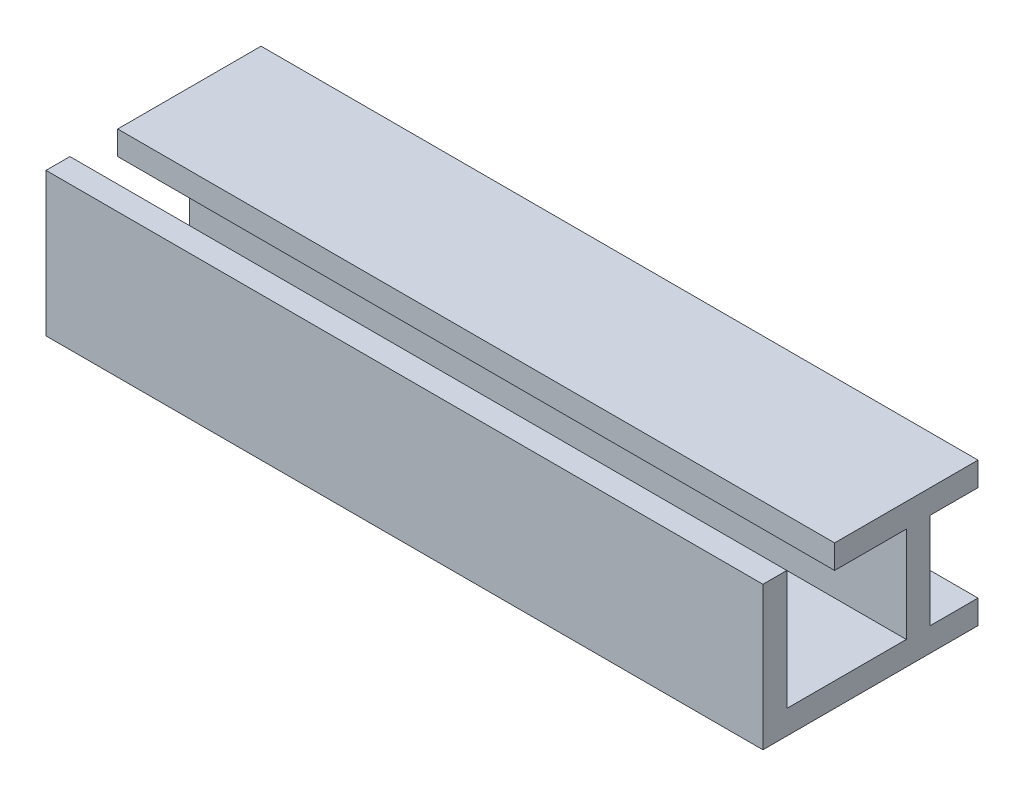
ISO-10303-21;
HEADER;
FILE_DESCRIPTION(('STEP AP214'),'2;1');
FILE_NAME('part.step','',(''),(''),'','','');
FILE_SCHEMA(('AUTOMOTIVE_DESIGN { 1 0 10303 214 1 1 1 1 }'));
ENDSEC;
DATA;
#1=APPLICATION_CONTEXT('core data for automotive mechanical design processes');
#2=APPLICATION_PROTOCOL_DEFINITION('international standard','automotive_design',2000,#1);
#3=PRODUCT_CONTEXT('',#1,'mechanical');
#4=PRODUCT('Part','Part','',(#3));
#5=PRODUCT_RELATED_PRODUCT_CATEGORY('part','',(#4));
#6=PRODUCT_DEFINITION_FORMATION('','',#4);
#7=PRODUCT_DEFINITION_CONTEXT('part definition',#1,'design');
#8=PRODUCT_DEFINITION('design','',#6,#7);
#9=PRODUCT_DEFINITION_SHAPE('','',#8);
#10=(LENGTH_UNIT() NAMED_UNIT(*) SI_UNIT(.MILLI.,.METRE.));
#11=(NAMED_UNIT(*) PLANE_ANGLE_UNIT() SI_UNIT($,.RADIAN.));
#12=(NAMED_UNIT(*) SI_UNIT($,.STERADIAN.) SOLID_ANGLE_UNIT());
#13=UNCERTAINTY_MEASURE_WITH_UNIT(LENGTH_MEASURE(1.E-05),#10,'distance_accuracy_value','');
#14=(GEOMETRIC_REPRESENTATION_CONTEXT(3) GLOBAL_UNCERTAINTY_ASSIGNED_CONTEXT((#13)) GLOBAL_UNIT_ASSIGNED_CONTEXT((#10,
#11,#12)) REPRESENTATION_CONTEXT('',''));
#15=CARTESIAN_POINT('',(0.,0.,0.));
#16=DIRECTION('',(0.,0.,1.));
#17=DIRECTION('',(1.,0.,0.));
#18=AXIS2_PLACEMENT_3D('',#15,#16,#17);
#19=CARTESIAN_POINT('',(150.,5.,0.));
#20=DIRECTION('',(0.,1.,0.));
#21=DIRECTION('',(0.,0.,1.));
#22=AXIS2_PLACEMENT_3D('',#19,#20,#21);
#23=PLANE('',#22);
#24=DIRECTION('',(0.,0.,-1.));
#25=VECTOR('',#24,1.);
#26=CARTESIAN_POINT('',(0.,5.,0.));
#27=LINE('',#26,#25);
#28=CARTESIAN_POINT('',(0.,5.,-5.));
#29=VERTEX_POINT('',#28);
#30=CARTESIAN_POINT('',(0.,5.,-30.));
#31=VERTEX_POINT('',#30);
#32=EDGE_CURVE('E192',#29,#31,#27,.T.);
#33=ORIENTED_EDGE('',*,*,#32,.F.);
#34=DIRECTION('',(-1.,0.,0.));
#35=VECTOR('',#34,1.);
#36=CARTESIAN_POINT('',(150.,5.,-5.));
#37=LINE('',#36,#35);
#38=CARTESIAN_POINT('',(150.,5.,-5.));
#39=VERTEX_POINT('',#38);
#40=EDGE_CURVE('E87',#39,#29,#37,.T.);
#41=ORIENTED_EDGE('',*,*,#40,.F.);
#42=DIRECTION('',(0.,0.,-1.));
#43=VECTOR('',#42,1.);
#44=CARTESIAN_POINT('',(150.,5.,0.));
#45=LINE('',#44,#43);
#46=CARTESIAN_POINT('',(150.,5.,-30.));
#47=VERTEX_POINT('',#46);
#48=EDGE_CURVE('E288',#39,#47,#45,.T.);
#49=ORIENTED_EDGE('',*,*,#48,.T.);
#50=DIRECTION('',(-1.,0.,0.));
#51=VECTOR('',#50,1.);
#52=CARTESIAN_POINT('',(150.,5.,-30.));
#53=LINE('',#52,#51);
#54=EDGE_CURVE('E12',#47,#31,#53,.T.);
#55=ORIENTED_EDGE('',*,*,#54,.T.);
#56=EDGE_LOOP('',(#33,#41,#49,#55));
#57=FACE_BOUND('',#56,.T.);
#58=ADVANCED_FACE('F77',(#57),#23,.T.);
#59=CARTESIAN_POINT('',(150.,0.,-5.));
#60=DIRECTION('',(0.,0.,1.));
#61=DIRECTION('',(0.,-1.,0.));
#62=AXIS2_PLACEMENT_3D('',#59,#60,#61);
#63=PLANE('',#62);
#64=DIRECTION('',(0.,1.,0.));
#65=VECTOR('',#64,1.);
#66=CARTESIAN_POINT('',(0.,0.,-5.));
#67=LINE('',#66,#65);
#68=CARTESIAN_POINT('',(0.,30.,-5.));
#69=VERTEX_POINT('',#68);
#70=EDGE_CURVE('E196',#29,#69,#67,.T.);
#71=ORIENTED_EDGE('',*,*,#70,.T.);
#72=DIRECTION('',(-1.,0.,0.));
#73=VECTOR('',#72,1.);
#74=CARTESIAN_POINT('',(150.,30.,-5.));
#75=LINE('',#74,#73);
#76=CARTESIAN_POINT('',(150.,30.,-5.));
#77=VERTEX_POINT('',#76);
#78=EDGE_CURVE('E234',#77,#69,#75,.T.);
#79=ORIENTED_EDGE('',*,*,#78,.F.);
#80=DIRECTION('',(0.,1.,0.));
#81=VECTOR('',#80,1.);
#82=CARTESIAN_POINT('',(150.,0.,-5.));
#83=LINE('',#82,#81);
#84=EDGE_CURVE('E291',#39,#77,#83,.T.);
#85=ORIENTED_EDGE('',*,*,#84,.F.);
#86=ORIENTED_EDGE('',*,*,#40,.T.);
#87=EDGE_LOOP('',(#71,#79,#85,#86));
#88=FACE_BOUND('',#87,.T.);
#89=ADVANCED_FACE('F324',(#88),#63,.F.);
#90=CARTESIAN_POINT('',(150.,30.,0.));
#91=DIRECTION('',(0.,1.,0.));
#92=DIRECTION('',(0.,0.,1.));
#93=AXIS2_PLACEMENT_3D('',#90,#91,#92);
#94=PLANE('',#93);
#95=DIRECTION('',(0.,0.,-1.));
#96=VECTOR('',#95,1.);
#97=CARTESIAN_POINT('',(0.,30.,0.));
#98=LINE('',#97,#96);
#99=CARTESIAN_POINT('',(0.,30.,0.));
#100=VERTEX_POINT('',#99);
#101=EDGE_CURVE('E205',#100,#69,#98,.T.);
#102=ORIENTED_EDGE('',*,*,#101,.F.);
#103=DIRECTION('',(-1.,0.,0.));
#104=VECTOR('',#103,1.);
#105=CARTESIAN_POINT('',(150.,30.,0.));
#106=LINE('',#105,#104);
#107=CARTESIAN_POINT('',(150.,30.,0.));
#108=VERTEX_POINT('',#107);
#109=EDGE_CURVE('E232',#108,#100,#106,.T.);
#110=ORIENTED_EDGE('',*,*,#109,.F.);
#111=DIRECTION('',(0.,0.,-1.));
#112=VECTOR('',#111,1.);
#113=CARTESIAN_POINT('',(150.,30.,0.));
#114=LINE('',#113,#112);
#115=EDGE_CURVE('E293',#108,#77,#114,.T.);
#116=ORIENTED_EDGE('',*,*,#115,.T.);
#117=ORIENTED_EDGE('',*,*,#78,.T.);
#118=EDGE_LOOP('',(#102,#110,#116,#117));
#119=FACE_BOUND('',#118,.T.);
#120=ADVANCED_FACE('F308',(#119),#94,.T.);
#121=CARTESIAN_POINT('',(150.,0.,0.));
#122=DIRECTION('',(0.,0.,1.));
#123=DIRECTION('',(1.,0.,0.));
#124=AXIS2_PLACEMENT_3D('',#121,#122,#123);
#125=PLANE('',#124);
#126=DIRECTION('',(0.,1.,0.));
#127=VECTOR('',#126,1.);
#128=CARTESIAN_POINT('',(0.,0.,0.));
#129=LINE('',#128,#127);
#130=CARTESIAN_POINT('',(0.,0.,0.));
#131=VERTEX_POINT('',#130);
#132=EDGE_CURVE('E208',#131,#100,#129,.T.);
#133=ORIENTED_EDGE('',*,*,#132,.F.);
#134=DIRECTION('',(-1.,0.,0.));
#135=VECTOR('',#134,1.);
#136=CARTESIAN_POINT('',(150.,0.,0.));
#137=LINE('',#136,#135);
#138=CARTESIAN_POINT('',(150.,0.,0.));
#139=VERTEX_POINT('',#138);
#140=EDGE_CURVE('E230',#139,#131,#137,.T.);
#141=ORIENTED_EDGE('',*,*,#140,.F.);
#142=DIRECTION('',(0.,1.,0.));
#143=VECTOR('',#142,1.);
#144=CARTESIAN_POINT('',(150.,0.,0.));
#145=LINE('',#144,#143);
#146=EDGE_CURVE('E299',#139,#108,#145,.T.);
#147=ORIENTED_EDGE('',*,*,#146,.T.);
#148=ORIENTED_EDGE('',*,*,#109,.T.);
#149=EDGE_LOOP('',(#133,#141,#147,#148));
#150=FACE_BOUND('',#149,.T.);
#151=ADVANCED_FACE('F313',(#150),#125,.T.);
#152=CARTESIAN_POINT('',(150.,0.,0.));
#153=DIRECTION('',(0.,1.,0.));
#154=DIRECTION('',(0.,0.,1.));
#155=AXIS2_PLACEMENT_3D('',#152,#153,#154);
#156=PLANE('',#155);
#157=DIRECTION('',(0.,0.,-1.));
#158=VECTOR('',#157,1.);
#159=CARTESIAN_POINT('',(0.,0.,0.));
#160=LINE('',#159,#158);
#161=CARTESIAN_POINT('',(0.,0.,-45.));
#162=VERTEX_POINT('',#161);
#163=EDGE_CURVE('E211',#131,#162,#160,.T.);
#164=ORIENTED_EDGE('',*,*,#163,.T.);
#165=DIRECTION('',(-1.,0.,0.));
#166=VECTOR('',#165,1.);
#167=CARTESIAN_POINT('',(150.,0.,-45.));
#168=LINE('',#167,#166);
#169=CARTESIAN_POINT('',(150.,0.,-45.));
#170=VERTEX_POINT('',#169);
#171=EDGE_CURVE('E227',#170,#162,#168,.T.);
#172=ORIENTED_EDGE('',*,*,#171,.F.);
#173=DIRECTION('',(0.,0.,-1.));
#174=VECTOR('',#173,1.);
#175=CARTESIAN_POINT('',(150.,0.,0.));
#176=LINE('',#175,#174);
#177=EDGE_CURVE('E296',#139,#170,#176,.T.);
#178=ORIENTED_EDGE('',*,*,#177,.F.);
#179=ORIENTED_EDGE('',*,*,#140,.T.);
#180=EDGE_LOOP('',(#164,#172,#178,#179));
#181=FACE_BOUND('',#180,.T.);
#182=ADVANCED_FACE('F318',(#181),#156,.F.);
#183=CARTESIAN_POINT('',(150.,0.,-45.));
#184=DIRECTION('',(0.,0.,1.));
#185=DIRECTION('',(1.,0.,0.));
#186=AXIS2_PLACEMENT_3D('',#183,#184,#185);
#187=PLANE('',#186);
#188=DIRECTION('',(0.,1.,0.));
#189=VECTOR('',#188,1.);
#190=CARTESIAN_POINT('',(0.,0.,-45.));
#191=LINE('',#190,#189);
#192=CARTESIAN_POINT('',(0.,5.,-45.));
#193=VERTEX_POINT('',#192);
#194=EDGE_CURVE('E213',#162,#193,#191,.T.);
#195=ORIENTED_EDGE('',*,*,#194,.T.);
#196=DIRECTION('',(-1.,0.,0.));
#197=VECTOR('',#196,1.);
#198=CARTESIAN_POINT('',(150.,5.,-45.));
#199=LINE('',#198,#197);
#200=CARTESIAN_POINT('',(150.,5.,-45.));
#201=VERTEX_POINT('',#200);
#202=EDGE_CURVE('E225',#201,#193,#199,.T.);
#203=ORIENTED_EDGE('',*,*,#202,.F.);
#204=DIRECTION('',(0.,1.,0.));
#205=VECTOR('',#204,1.);
#206=CARTESIAN_POINT('',(150.,0.,-45.));
#207=LINE('',#206,#205);
#208=EDGE_CURVE('E295',#170,#201,#207,.T.);
#209=ORIENTED_EDGE('',*,*,#208,.F.);
#210=ORIENTED_EDGE('',*,*,#171,.T.);
#211=EDGE_LOOP('',(#195,#203,#209,#210));
#212=FACE_BOUND('',#211,.T.);
#213=ADVANCED_FACE('F321',(#212),#187,.F.);
#214=CARTESIAN_POINT('',(0.,5.,-35.));
#215=VERTEX_POINT('',#214);
#216=EDGE_CURVE('E198',#215,#193,#27,.T.);
#217=ORIENTED_EDGE('',*,*,#216,.F.);
#218=DIRECTION('',(-1.,0.,0.));
#219=VECTOR('',#218,1.);
#220=CARTESIAN_POINT('',(150.,5.,-35.));
#221=LINE('',#220,#219);
#222=CARTESIAN_POINT('',(150.,5.,-35.));
#223=VERTEX_POINT('',#222);
#224=EDGE_CURVE('E223',#223,#215,#221,.T.);
#225=ORIENTED_EDGE('',*,*,#224,.F.);
#226=EDGE_CURVE('E258',#223,#201,#45,.T.);
#227=ORIENTED_EDGE('',*,*,#226,.T.);
#228=ORIENTED_EDGE('',*,*,#202,.T.);
#229=EDGE_LOOP('',(#217,#225,#227,#228));
#230=FACE_BOUND('',#229,.T.);
#231=ADVANCED_FACE('F256',(#230),#23,.T.);
#232=CARTESIAN_POINT('',(150.,0.,-35.));
#233=DIRECTION('',(0.,0.,1.));
#234=DIRECTION('',(1.,0.,0.));
#235=AXIS2_PLACEMENT_3D('',#232,#233,#234);
#236=PLANE('',#235);
#237=DIRECTION('',(0.,1.,0.));
#238=VECTOR('',#237,1.);
#239=CARTESIAN_POINT('',(0.,0.,-35.));
#240=LINE('',#239,#238);
#241=CARTESIAN_POINT('',(0.,25.,-35.));
#242=VERTEX_POINT('',#241);
#243=EDGE_CURVE('E216',#215,#242,#240,.T.);
#244=ORIENTED_EDGE('',*,*,#243,.T.);
#245=DIRECTION('',(-1.,0.,0.));
#246=VECTOR('',#245,1.);
#247=CARTESIAN_POINT('',(150.,25.,-35.));
#248=LINE('',#247,#246);
#249=CARTESIAN_POINT('',(150.,25.,-35.));
#250=VERTEX_POINT('',#249);
#251=EDGE_CURVE('E221',#250,#242,#248,.T.);
#252=ORIENTED_EDGE('',*,*,#251,.F.);
#253=DIRECTION('',(0.,1.,0.));
#254=VECTOR('',#253,1.);
#255=CARTESIAN_POINT('',(150.,0.,-35.));
#256=LINE('',#255,#254);
#257=EDGE_CURVE('E200',#223,#250,#256,.T.);
#258=ORIENTED_EDGE('',*,*,#257,.F.);
#259=ORIENTED_EDGE('',*,*,#224,.T.);
#260=EDGE_LOOP('',(#244,#252,#258,#259));
#261=FACE_BOUND('',#260,.T.);
#262=ADVANCED_FACE('F249',(#261),#236,.F.);
#263=CARTESIAN_POINT('',(150.,0.,-30.));
#264=DIRECTION('',(0.,0.,1.));
#265=DIRECTION('',(1.,0.,0.));
#266=AXIS2_PLACEMENT_3D('',#263,#264,#265);
#267=PLANE('',#266);
#268=DIRECTION('',(0.,1.,0.));
#269=VECTOR('',#268,1.);
#270=CARTESIAN_POINT('',(0.,0.,-30.));
#271=LINE('',#270,#269);
#272=CARTESIAN_POINT('',(0.,25.,-30.));
#273=VERTEX_POINT('',#272);
#274=EDGE_CURVE('E191',#31,#273,#271,.T.);
#275=ORIENTED_EDGE('',*,*,#274,.F.);
#276=ORIENTED_EDGE('',*,*,#54,.F.);
#277=DIRECTION('',(0.,1.,0.));
#278=VECTOR('',#277,1.);
#279=CARTESIAN_POINT('',(150.,0.,-30.));
#280=LINE('',#279,#278);
#281=CARTESIAN_POINT('',(150.,25.,-30.));
#282=VERTEX_POINT('',#281);
#283=EDGE_CURVE('E219',#47,#282,#280,.T.);
#284=ORIENTED_EDGE('',*,*,#283,.T.);
#285=DIRECTION('',(-1.,0.,0.));
#286=VECTOR('',#285,1.);
#287=CARTESIAN_POINT('',(150.,25.,-30.));
#288=LINE('',#287,#286);
#289=EDGE_CURVE('E96',#282,#273,#288,.T.);
#290=ORIENTED_EDGE('',*,*,#289,.T.);
#291=EDGE_LOOP('',(#275,#276,#284,#290));
#292=FACE_BOUND('',#291,.T.);
#293=ADVANCED_FACE('F281',(#292),#267,.T.);
#294=CARTESIAN_POINT('',(0.,0.,0.));
#295=DIRECTION('',(1.,0.,0.));
#296=DIRECTION('',(0.,0.,-1.));
#297=AXIS2_PLACEMENT_3D('',#294,#295,#296);
#298=PLANE('',#297);
#299=ORIENTED_EDGE('',*,*,#274,.T.);
#300=DIRECTION('',(0.,0.,-1.));
#301=VECTOR('',#300,1.);
#302=CARTESIAN_POINT('',(0.,25.,-15.));
#303=LINE('',#302,#301);
#304=CARTESIAN_POINT('',(0.,25.,-15.));
#305=VERTEX_POINT('',#304);
#306=EDGE_CURVE('E174',#305,#273,#303,.T.);
#307=ORIENTED_EDGE('',*,*,#306,.F.);
#308=DIRECTION('',(0.,-1.,0.));
#309=VECTOR('',#308,1.);
#310=CARTESIAN_POINT('',(0.,30.,-15.));
#311=LINE('',#310,#309);
#312=CARTESIAN_POINT('',(0.,30.,-15.));
#313=VERTEX_POINT('',#312);
#314=EDGE_CURVE('E162',#313,#305,#311,.T.);
#315=ORIENTED_EDGE('',*,*,#314,.F.);
#316=DIRECTION('',(0.,0.,-1.));
#317=VECTOR('',#316,1.);
#318=CARTESIAN_POINT('',(0.,30.,-15.));
#319=LINE('',#318,#317);
#320=CARTESIAN_POINT('',(0.,30.,-45.));
#321=VERTEX_POINT('',#320);
#322=EDGE_CURVE('E173',#313,#321,#319,.T.);
#323=ORIENTED_EDGE('',*,*,#322,.T.);
#324=DIRECTION('',(0.,-1.,0.));
#325=VECTOR('',#324,1.);
#326=CARTESIAN_POINT('',(0.,30.,-45.));
#327=LINE('',#326,#325);
#328=CARTESIAN_POINT('',(0.,25.,-45.));
#329=VERTEX_POINT('',#328);
#330=EDGE_CURVE('E179',#321,#329,#327,.T.);
#331=ORIENTED_EDGE('',*,*,#330,.T.);
#332=EDGE_CURVE('E176',#242,#329,#303,.T.);
#333=ORIENTED_EDGE('',*,*,#332,.F.);
#334=ORIENTED_EDGE('',*,*,#243,.F.);
#335=ORIENTED_EDGE('',*,*,#216,.T.);
#336=ORIENTED_EDGE('',*,*,#194,.F.);
#337=ORIENTED_EDGE('',*,*,#163,.F.);
#338=ORIENTED_EDGE('',*,*,#132,.T.);
#339=ORIENTED_EDGE('',*,*,#101,.T.);
#340=ORIENTED_EDGE('',*,*,#70,.F.);
#341=ORIENTED_EDGE('',*,*,#32,.T.);
#342=EDGE_LOOP('',(#299,#307,#315,#323,#331,#333,#334,#335,#336,#337,#338,#339,#340,#341));
#343=FACE_BOUND('',#342,.T.);
#344=ADVANCED_FACE('F171',(#343),#298,.F.);
#345=CARTESIAN_POINT('',(150.,0.,0.));
#346=DIRECTION('',(1.,0.,0.));
#347=DIRECTION('',(0.,0.,-1.));
#348=AXIS2_PLACEMENT_3D('',#345,#346,#347);
#349=PLANE('',#348);
#350=ORIENTED_EDGE('',*,*,#283,.F.);
#351=ORIENTED_EDGE('',*,*,#48,.F.);
#352=ORIENTED_EDGE('',*,*,#84,.T.);
#353=ORIENTED_EDGE('',*,*,#115,.F.);
#354=ORIENTED_EDGE('',*,*,#146,.F.);
#355=ORIENTED_EDGE('',*,*,#177,.T.);
#356=ORIENTED_EDGE('',*,*,#208,.T.);
#357=ORIENTED_EDGE('',*,*,#226,.F.);
#358=ORIENTED_EDGE('',*,*,#257,.T.);
#359=DIRECTION('',(0.,0.,-1.));
#360=VECTOR('',#359,1.);
#361=CARTESIAN_POINT('',(150.,25.,-15.));
#362=LINE('',#361,#360);
#363=CARTESIAN_POINT('',(150.,25.,-45.));
#364=VERTEX_POINT('',#363);
#365=EDGE_CURVE('E181',#250,#364,#362,.T.);
#366=ORIENTED_EDGE('',*,*,#365,.T.);
#367=DIRECTION('',(0.,-1.,0.));
#368=VECTOR('',#367,1.);
#369=CARTESIAN_POINT('',(150.,30.,-45.));
#370=LINE('',#369,#368);
#371=CARTESIAN_POINT('',(150.,30.,-45.));
#372=VERTEX_POINT('',#371);
#373=EDGE_CURVE('E239',#372,#364,#370,.T.);
#374=ORIENTED_EDGE('',*,*,#373,.F.);
#375=DIRECTION('',(0.,0.,-1.));
#376=VECTOR('',#375,1.);
#377=CARTESIAN_POINT('',(150.,30.,-15.));
#378=LINE('',#377,#376);
#379=CARTESIAN_POINT('',(150.,30.,-15.));
#380=VERTEX_POINT('',#379);
#381=EDGE_CURVE('E166',#380,#372,#378,.T.);
#382=ORIENTED_EDGE('',*,*,#381,.F.);
#383=DIRECTION('',(0.,-1.,0.));
#384=VECTOR('',#383,1.);
#385=CARTESIAN_POINT('',(150.,30.,-15.));
#386=LINE('',#385,#384);
#387=CARTESIAN_POINT('',(150.,25.,-15.));
#388=VERTEX_POINT('',#387);
#389=EDGE_CURVE('E164',#380,#388,#386,.T.);
#390=ORIENTED_EDGE('',*,*,#389,.T.);
#391=EDGE_CURVE('E237',#388,#282,#362,.T.);
#392=ORIENTED_EDGE('',*,*,#391,.T.);
#393=EDGE_LOOP('',(#350,#351,#352,#353,#354,#355,#356,#357,#358,#366,#374,#382,#390,#392));
#394=FACE_BOUND('',#393,.T.);
#395=ADVANCED_FACE('F287',(#394),#349,.T.);
#396=CARTESIAN_POINT('',(150.,25.,-15.));
#397=DIRECTION('',(0.,1.,0.));
#398=DIRECTION('',(0.,0.,1.));
#399=AXIS2_PLACEMENT_3D('',#396,#397,#398);
#400=PLANE('',#399);
#401=ORIENTED_EDGE('',*,*,#289,.F.);
#402=ORIENTED_EDGE('',*,*,#391,.F.);
#403=DIRECTION('',(-1.,0.,0.));
#404=VECTOR('',#403,1.);
#405=CARTESIAN_POINT('',(150.,25.,-15.));
#406=LINE('',#405,#404);
#407=EDGE_CURVE('E81',#388,#305,#406,.T.);
#408=ORIENTED_EDGE('',*,*,#407,.T.);
#409=ORIENTED_EDGE('',*,*,#306,.T.);
#410=EDGE_LOOP('',(#401,#402,#408,#409));
#411=FACE_BOUND('',#410,.T.);
#412=ADVANCED_FACE('F341',(#411),#400,.F.);
#413=ORIENTED_EDGE('',*,*,#365,.F.);
#414=ORIENTED_EDGE('',*,*,#251,.T.);
#415=ORIENTED_EDGE('',*,*,#332,.T.);
#416=DIRECTION('',(-1.,0.,0.));
#417=VECTOR('',#416,1.);
#418=CARTESIAN_POINT('',(150.,25.,-45.));
#419=LINE('',#418,#417);
#420=EDGE_CURVE('E186',#364,#329,#419,.T.);
#421=ORIENTED_EDGE('',*,*,#420,.F.);
#422=EDGE_LOOP('',(#413,#414,#415,#421));
#423=FACE_BOUND('',#422,.T.);
#424=ADVANCED_FACE('F244',(#423),#400,.F.);
#425=CARTESIAN_POINT('',(150.,30.,-45.));
#426=DIRECTION('',(0.,0.,-1.));
#427=DIRECTION('',(-1.,0.,0.));
#428=AXIS2_PLACEMENT_3D('',#425,#426,#427);
#429=PLANE('',#428);
#430=ORIENTED_EDGE('',*,*,#330,.F.);
#431=DIRECTION('',(-1.,0.,0.));
#432=VECTOR('',#431,1.);
#433=CARTESIAN_POINT('',(150.,30.,-45.));
#434=LINE('',#433,#432);
#435=EDGE_CURVE('E153',#372,#321,#434,.T.);
#436=ORIENTED_EDGE('',*,*,#435,.F.);
#437=ORIENTED_EDGE('',*,*,#373,.T.);
#438=ORIENTED_EDGE('',*,*,#420,.T.);
#439=EDGE_LOOP('',(#430,#436,#437,#438));
#440=FACE_BOUND('',#439,.T.);
#441=ADVANCED_FACE('F339',(#440),#429,.T.);
#442=CARTESIAN_POINT('',(150.,30.,-15.));
#443=DIRECTION('',(0.,1.,0.));
#444=DIRECTION('',(0.,0.,1.));
#445=AXIS2_PLACEMENT_3D('',#442,#443,#444);
#446=PLANE('',#445);
#447=ORIENTED_EDGE('',*,*,#322,.F.);
#448=DIRECTION('',(-1.,0.,0.));
#449=VECTOR('',#448,1.);
#450=CARTESIAN_POINT('',(150.,30.,-15.));
#451=LINE('',#450,#449);
#452=EDGE_CURVE('E159',#380,#313,#451,.T.);
#453=ORIENTED_EDGE('',*,*,#452,.F.);
#454=ORIENTED_EDGE('',*,*,#381,.T.);
#455=ORIENTED_EDGE('',*,*,#435,.T.);
#456=EDGE_LOOP('',(#447,#453,#454,#455));
#457=FACE_BOUND('',#456,.T.);
#458=ADVANCED_FACE('F178',(#457),#446,.T.);
#459=CARTESIAN_POINT('',(150.,30.,-15.));
#460=DIRECTION('',(0.,0.,-1.));
#461=DIRECTION('',(-1.,0.,0.));
#462=AXIS2_PLACEMENT_3D('',#459,#460,#461);
#463=PLANE('',#462);
#464=ORIENTED_EDGE('',*,*,#314,.T.);
#465=ORIENTED_EDGE('',*,*,#407,.F.);
#466=ORIENTED_EDGE('',*,*,#389,.F.);
#467=ORIENTED_EDGE('',*,*,#452,.T.);
#468=EDGE_LOOP('',(#464,#465,#466,#467));
#469=FACE_BOUND('',#468,.T.);
#470=ADVANCED_FACE('F79',(#469),#463,.F.);
#471=CLOSED_SHELL('',(#58,#89,#120,#151,#182,#213,#231,#262,#293,#344,#395,#412,#424,#441,#458,#470));
#472=MANIFOLD_SOLID_BREP('B2',#471);
#473=ADVANCED_BREP_SHAPE_REPRESENTATION('',(#18,#472),#14);
#474=SHAPE_DEFINITION_REPRESENTATION(#9,#473);
ENDSEC;
END-ISO-10303-21;
